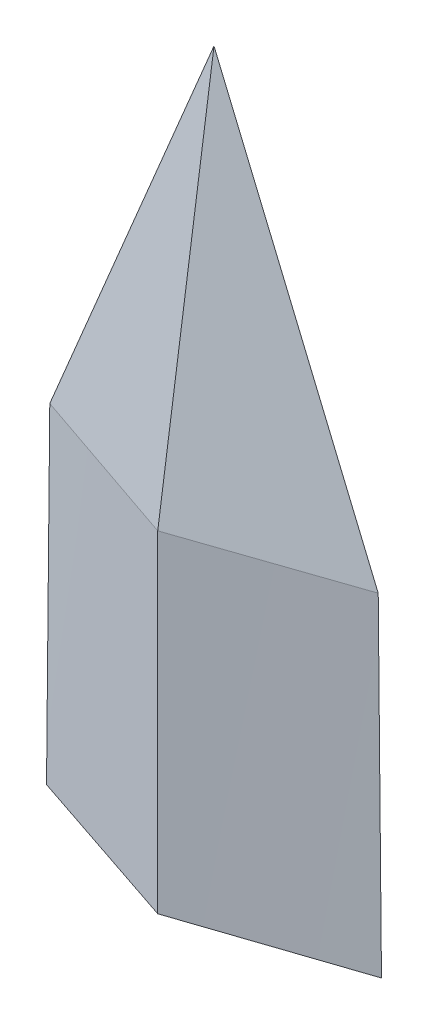
ISO-10303-21;
HEADER;
FILE_DESCRIPTION(('STEP AP214'),'2;1');
FILE_NAME('part.step','',(''),(''),'','','');
FILE_SCHEMA(('AUTOMOTIVE_DESIGN { 1 0 10303 214 1 1 1 1 }'));
ENDSEC;
DATA;
#1=APPLICATION_CONTEXT('core data for automotive mechanical design processes');
#2=APPLICATION_PROTOCOL_DEFINITION('international standard','automotive_design',2000,#1);
#3=PRODUCT_CONTEXT('',#1,'mechanical');
#4=PRODUCT('Part','Part','',(#3));
#5=PRODUCT_RELATED_PRODUCT_CATEGORY('part','',(#4));
#6=PRODUCT_DEFINITION_FORMATION('','',#4);
#7=PRODUCT_DEFINITION_CONTEXT('part definition',#1,'design');
#8=PRODUCT_DEFINITION('design','',#6,#7);
#9=PRODUCT_DEFINITION_SHAPE('','',#8);
#10=(LENGTH_UNIT() NAMED_UNIT(*) SI_UNIT(.MILLI.,.METRE.));
#11=(NAMED_UNIT(*) PLANE_ANGLE_UNIT() SI_UNIT($,.RADIAN.));
#12=(NAMED_UNIT(*) SI_UNIT($,.STERADIAN.) SOLID_ANGLE_UNIT());
#13=UNCERTAINTY_MEASURE_WITH_UNIT(LENGTH_MEASURE(1.E-05),#10,'distance_accuracy_value','');
#14=(GEOMETRIC_REPRESENTATION_CONTEXT(3) GLOBAL_UNCERTAINTY_ASSIGNED_CONTEXT((#13)) GLOBAL_UNIT_ASSIGNED_CONTEXT((#10,
#11,#12)) REPRESENTATION_CONTEXT('',''));
#15=CARTESIAN_POINT('',(0.,0.,0.));
#16=DIRECTION('',(0.,0.,1.));
#17=DIRECTION('',(1.,0.,0.));
#18=AXIS2_PLACEMENT_3D('',#15,#16,#17);
#19=CARTESIAN_POINT('',(-32.1030984066137,13.457832355646,-93.6987043311591));
#20=DIRECTION('',(-0.321172823266874,0.13463778349272,-0.937401026696127));
#21=DIRECTION('',(0.946014601230734,0.,-0.3241240106167));
#22=AXIS2_PLACEMENT_3D('',#19,#20,#21);
#23=PLANE('',#22);
#24=DIRECTION('',(0.386610447032503,0.922243114501447,0.));
#25=VECTOR('',#24,1.);
#26=CARTESIAN_POINT('',(181.068628680817,1174.33721565241,0.));
#27=LINE('',#26,#25);
#28=CARTESIAN_POINT('',(148.634785732328,1096.96763455169,0.));
#29=VERTEX_POINT('',#28);
#30=CARTESIAN_POINT('',(181.068628680818,1174.33721565241,0.));
#31=VERTEX_POINT('',#30);
#32=EDGE_CURVE('E257',#29,#31,#27,.T.);
#33=ORIENTED_EDGE('',*,*,#32,.T.);
#34=DIRECTION('',(0.,-0.989842276180155,-0.14216985716561));
#35=VECTOR('',#34,1.);
#36=CARTESIAN_POINT('',(181.068628680818,23.7360188615762,-165.259467835217));
#37=LINE('',#36,#35);
#38=CARTESIAN_POINT('',(181.068628680817,1096.96763455169,-11.1125));
#39=VERTEX_POINT('',#38);
#40=EDGE_CURVE('E12',#31,#39,#37,.T.);
#41=ORIENTED_EDGE('',*,*,#40,.T.);
#42=DIRECTION('',(-0.946014601230734,0.,0.3241240106167));
#43=VECTOR('',#42,1.);
#44=CARTESIAN_POINT('',(181.068628680817,1096.96763455169,-11.1125));
#45=LINE('',#44,#43);
#46=EDGE_CURVE('E125',#39,#29,#45,.T.);
#47=ORIENTED_EDGE('',*,*,#46,.T.);
#48=EDGE_LOOP('',(#33,#41,#47));
#49=FACE_BOUND('',#48,.T.);
#50=ADVANCED_FACE('F61',(#49),#23,.T.);
#51=CARTESIAN_POINT('',(-32.1030984066137,13.457832355646,93.6987043311591));
#52=DIRECTION('',(-0.321172823266874,0.13463778349272,0.937401026696127));
#53=DIRECTION('',(0.946014601230734,0.,0.3241240106167));
#54=AXIS2_PLACEMENT_3D('',#51,#52,#53);
#55=PLANE('',#54);
#56=DIRECTION('',(-0.946014601230734,0.,-0.3241240106167));
#57=VECTOR('',#56,1.);
#58=CARTESIAN_POINT('',(181.068628680817,1096.96763455169,11.1125));
#59=LINE('',#58,#57);
#60=CARTESIAN_POINT('',(181.068628680818,1096.96763455169,11.1125));
#61=VERTEX_POINT('',#60);
#62=EDGE_CURVE('E130',#61,#29,#59,.T.);
#63=ORIENTED_EDGE('',*,*,#62,.F.);
#64=DIRECTION('',(0.,0.989842276180155,-0.14216985716561));
#65=VECTOR('',#64,1.);
#66=CARTESIAN_POINT('',(181.068628680818,23.7360188615762,165.259467835217));
#67=LINE('',#66,#65);
#68=EDGE_CURVE('E74',#61,#31,#67,.T.);
#69=ORIENTED_EDGE('',*,*,#68,.T.);
#70=ORIENTED_EDGE('',*,*,#32,.F.);
#71=EDGE_LOOP('',(#63,#69,#70));
#72=FACE_BOUND('',#71,.T.);
#73=ADVANCED_FACE('F232',(#72),#55,.T.);
#74=CARTESIAN_POINT('',(219.716026671538,465.168027231046,0.));
#75=CARTESIAN_POINT('',(213.502471629307,1096.96763455169,0.));
#76=CARTESIAN_POINT('',(213.274793673085,465.168027231046,1.85208333333331));
#77=CARTESIAN_POINT('',(208.096831137892,1096.96763455169,1.85208333333331));
#78=CARTESIAN_POINT('',(206.833560674631,465.168027231046,3.70416666666664));
#79=CARTESIAN_POINT('',(202.691190646477,1096.96763455169,3.70416666666663));
#80=CARTESIAN_POINT('',(193.951094677724,465.168027231046,7.4083333333333));
#81=CARTESIAN_POINT('',(191.879909663647,1096.96763455169,7.4083333333333));
#82=CARTESIAN_POINT('',(187.509861679271,465.168027231046,9.26041666666665));
#83=CARTESIAN_POINT('',(186.474269172232,1096.96763455169,9.26041666666665));
#84=CARTESIAN_POINT('',(181.068628680817,465.168027231046,11.1125));
#85=CARTESIAN_POINT('',(181.068628680817,1096.96763455169,11.1125));
#86=B_SPLINE_SURFACE_WITH_KNOTS('',3,1,((#74,#75),(#76,#77),(#78,#79),(#80,#81),(#82,#83),(#84,
#85)),.UNSPECIFIED.,.F.,.F.,.F.,(4,2,4),(2,2),(0.,0.5,1.),(0.,1.),.UNSPECIFIED.);
#87=DIRECTION('',(0.,1.,0.));
#88=VECTOR('',#87,1.);
#89=CARTESIAN_POINT('',(181.068628680817,781.067830891368,11.1125));
#90=LINE('',#89,#88);
#91=CARTESIAN_POINT('',(181.068628680817,1031.46221565241,11.1125));
#92=VERTEX_POINT('',#91);
#93=EDGE_CURVE('E68',#92,#61,#90,.T.);
#94=CARTESIAN_POINT('',(181.068628680817,1031.46221565241,11.1125));
#95=CARTESIAN_POINT('',(184.245268499691,1031.46221565241,10.0453152621779));
#96=CARTESIAN_POINT('',(187.421908318565,1031.46221565241,8.97813052435588));
#97=CARTESIAN_POINT('',(193.775187956312,1031.46221565241,6.84376104871176));
#98=CARTESIAN_POINT('',(196.951827775186,1031.46221565241,5.7765763108897));
#99=CARTESIAN_POINT('',(204.801210829439,1031.46221565241,3.13959438204509));
#100=CARTESIAN_POINT('',(209.473954064819,1031.46221565241,1.56979719102255));
#101=CARTESIAN_POINT('',(214.146697300198,1031.46221565241,0.));
#102=B_SPLINE_CURVE_WITH_KNOTS('',3,(#94,#95,#96,#97,#98,#99,#100,#101),.UNSPECIFIED.,.F.,.F.,
(4,2,2,4),(0.,10.0533235415682,20.1066470831363,34.8947887203586),.UNSPECIFIED.);
#103=CARTESIAN_POINT('',(214.146697300198,1031.46221565241,0.));
#104=VERTEX_POINT('',#103);
#105=EDGE_CURVE('E203',#92,#104,#102,.T.);
#106=DIRECTION('',(-0.00983421721197636,0.99995164291671,0.));
#107=VECTOR('',#106,1.);
#108=CARTESIAN_POINT('',(219.716026671538,465.168027231046,0.));
#109=LINE('',#108,#107);
#110=CARTESIAN_POINT('',(213.502471629307,1096.96763455169,0.));
#111=VERTEX_POINT('',#110);
#112=EDGE_CURVE('E120',#104,#111,#109,.T.);
#113=DIRECTION('',(-0.946014601230734,0.,0.3241240106167));
#114=VECTOR('',#113,1.);
#115=CARTESIAN_POINT('',(213.502471629307,1096.96763455169,0.));
#116=LINE('',#115,#114);
#117=EDGE_CURVE('E127',#111,#61,#116,.T.);
#118=ORIENTED_EDGE('',*,*,#93,.F.);
#119=ORIENTED_EDGE('',*,*,#105,.T.);
#120=ORIENTED_EDGE('',*,*,#112,.T.);
#121=ORIENTED_EDGE('',*,*,#117,.T.);
#122=EDGE_LOOP('',(#118,#119,#120,#121));
#123=FACE_BOUND('',#122,.T.);
#124=ADVANCED_FACE('F165',(#123),#86,.F.);
#125=CARTESIAN_POINT('',(181.068628680817,465.168027231046,11.1125));
#126=CARTESIAN_POINT('',(181.068628680817,1096.96763455169,11.1125));
#127=CARTESIAN_POINT('',(174.627395682364,465.168027231046,9.26041666666668));
#128=CARTESIAN_POINT('',(175.662988189402,1096.96763455169,9.26041666666663));
#129=CARTESIAN_POINT('',(168.186162683911,465.168027231046,7.40833333333335));
#130=CARTESIAN_POINT('',(170.257347697988,1096.96763455169,7.40833333333328));
#131=CARTESIAN_POINT('',(155.303696687004,465.168027231046,3.70416666666668));
#132=CARTESIAN_POINT('',(159.446066715158,1096.96763455169,3.70416666666661));
#133=CARTESIAN_POINT('',(148.86246368855,465.168027231046,1.85208333333334));
#134=CARTESIAN_POINT('',(154.040426223743,1096.96763455169,1.8520833333333));
#135=CARTESIAN_POINT('',(142.421230690097,465.168027231046,0.));
#136=CARTESIAN_POINT('',(148.634785732328,1096.96763455169,0.));
#137=B_SPLINE_SURFACE_WITH_KNOTS('',3,1,((#125,#126),(#127,#128),(#129,#130),(#131,#132),(#133,
#134),(#135,#136)),.UNSPECIFIED.,.F.,.F.,.F.,(4,2,4),(2,2),(0.,0.5,1.),(0.,1.),.UNSPECIFIED.);
#138=DIRECTION('',(0.00983421721197636,0.99995164291671,0.));
#139=VECTOR('',#138,1.);
#140=CARTESIAN_POINT('',(145.528008211213,781.067830891368,0.));
#141=LINE('',#140,#139);
#142=CARTESIAN_POINT('',(147.990560061437,1031.46221565241,0.));
#143=VERTEX_POINT('',#142);
#144=EDGE_CURVE('E136',#143,#29,#141,.T.);
#145=CARTESIAN_POINT('',(147.990560061437,1031.46221565241,0.));
#146=CARTESIAN_POINT('',(151.16719988031,1031.46221565241,1.06718473782206));
#147=CARTESIAN_POINT('',(154.343839699184,1031.46221565241,2.13436947564412));
#148=CARTESIAN_POINT('',(160.697119336932,1031.46221565241,4.26873895128824));
#149=CARTESIAN_POINT('',(163.873759155805,1031.46221565241,5.3359236891103));
#150=CARTESIAN_POINT('',(171.723142210058,1031.46221565241,7.9729056179549));
#151=CARTESIAN_POINT('',(176.395885445438,1031.46221565241,9.54270280897745));
#152=CARTESIAN_POINT('',(181.068628680817,1031.46221565241,11.1125));
#153=B_SPLINE_CURVE_WITH_KNOTS('',3,(#145,#146,#147,#148,#149,#150,#151,#152),.UNSPECIFIED.,.F.,
.F.,(4,2,2,4),(0.,10.0533235415682,20.1066470831363,34.8947887203586),.UNSPECIFIED.);
#154=EDGE_CURVE('E82',#143,#92,#153,.T.);
#155=ORIENTED_EDGE('',*,*,#144,.F.);
#156=ORIENTED_EDGE('',*,*,#154,.T.);
#157=ORIENTED_EDGE('',*,*,#93,.T.);
#158=ORIENTED_EDGE('',*,*,#62,.T.);
#159=EDGE_LOOP('',(#155,#156,#157,#158));
#160=FACE_BOUND('',#159,.T.);
#161=ADVANCED_FACE('F63',(#160),#137,.F.);
#162=CARTESIAN_POINT('',(219.716026671538,465.168027231046,0.));
#163=CARTESIAN_POINT('',(213.502471629307,1096.96763455169,0.));
#164=CARTESIAN_POINT('',(213.274793673085,465.168027231046,-1.85208333333331));
#165=CARTESIAN_POINT('',(208.096831137892,1096.96763455169,-1.85208333333331));
#166=CARTESIAN_POINT('',(206.833560674631,465.168027231046,-3.70416666666664));
#167=CARTESIAN_POINT('',(202.691190646477,1096.96763455169,-3.70416666666663));
#168=CARTESIAN_POINT('',(193.951094677724,465.168027231046,-7.4083333333333));
#169=CARTESIAN_POINT('',(191.879909663647,1096.96763455169,-7.4083333333333));
#170=CARTESIAN_POINT('',(187.509861679271,465.168027231046,-9.26041666666665));
#171=CARTESIAN_POINT('',(186.474269172232,1096.96763455169,-9.26041666666665));
#172=CARTESIAN_POINT('',(181.068628680817,465.168027231046,-11.1125));
#173=CARTESIAN_POINT('',(181.068628680817,1096.96763455169,-11.1125));
#174=B_SPLINE_SURFACE_WITH_KNOTS('',3,1,((#162,#163),(#164,#165),(#166,#167),(#168,#169),(#170,
#171),(#172,#173)),.UNSPECIFIED.,.F.,.F.,.F.,(4,2,4),(2,2),(0.,0.5,1.),(0.,1.),.UNSPECIFIED.);
#175=CARTESIAN_POINT('',(214.146697300198,1031.46221565241,0.));
#176=CARTESIAN_POINT('',(210.970057481325,1031.46221565241,-1.06718473782206));
#177=CARTESIAN_POINT('',(207.793417662451,1031.46221565241,-2.13436947564412));
#178=CARTESIAN_POINT('',(201.440138024703,1031.46221565241,-4.26873895128824));
#179=CARTESIAN_POINT('',(198.26349820583,1031.46221565241,-5.3359236891103));
#180=CARTESIAN_POINT('',(190.414115151577,1031.46221565241,-7.9729056179549));
#181=CARTESIAN_POINT('',(185.741371916197,1031.46221565241,-9.54270280897745));
#182=CARTESIAN_POINT('',(181.068628680817,1031.46221565241,-11.1125));
#183=B_SPLINE_CURVE_WITH_KNOTS('',3,(#175,#176,#177,#178,#179,#180,#181,#182),.UNSPECIFIED.,.F.,
.F.,(4,2,2,4),(0.,10.0533235415682,20.1066470831363,34.8947887203586),.UNSPECIFIED.);
#184=CARTESIAN_POINT('',(181.068628680817,1031.46221565241,-11.1125));
#185=VERTEX_POINT('',#184);
#186=EDGE_CURVE('E112',#104,#185,#183,.T.);
#187=DIRECTION('',(0.,1.,0.));
#188=VECTOR('',#187,1.);
#189=CARTESIAN_POINT('',(181.068628680817,781.067830891368,-11.1125));
#190=LINE('',#189,#188);
#191=EDGE_CURVE('E90',#185,#39,#190,.T.);
#192=DIRECTION('',(-0.946014601230734,0.,-0.3241240106167));
#193=VECTOR('',#192,1.);
#194=CARTESIAN_POINT('',(213.502471629307,1096.96763455169,0.));
#195=LINE('',#194,#193);
#196=EDGE_CURVE('E132',#111,#39,#195,.T.);
#197=ORIENTED_EDGE('',*,*,#112,.F.);
#198=ORIENTED_EDGE('',*,*,#186,.T.);
#199=ORIENTED_EDGE('',*,*,#191,.T.);
#200=ORIENTED_EDGE('',*,*,#196,.F.);
#201=EDGE_LOOP('',(#197,#198,#199,#200));
#202=FACE_BOUND('',#201,.T.);
#203=ADVANCED_FACE('F119',(#202),#174,.T.);
#204=CARTESIAN_POINT('',(181.068628680817,465.168027231046,-11.1125));
#205=CARTESIAN_POINT('',(181.068628680817,1096.96763455169,-11.1125));
#206=CARTESIAN_POINT('',(174.627395682364,465.168027231046,-9.26041666666668));
#207=CARTESIAN_POINT('',(175.662988189402,1096.96763455169,-9.26041666666663));
#208=CARTESIAN_POINT('',(168.186162683911,465.168027231046,-7.40833333333335));
#209=CARTESIAN_POINT('',(170.257347697988,1096.96763455169,-7.40833333333328));
#210=CARTESIAN_POINT('',(155.303696687004,465.168027231046,-3.70416666666668));
#211=CARTESIAN_POINT('',(159.446066715158,1096.96763455169,-3.70416666666661));
#212=CARTESIAN_POINT('',(148.86246368855,465.168027231046,-1.85208333333334));
#213=CARTESIAN_POINT('',(154.040426223743,1096.96763455169,-1.8520833333333));
#214=CARTESIAN_POINT('',(142.421230690097,465.168027231046,0.));
#215=CARTESIAN_POINT('',(148.634785732328,1096.96763455169,0.));
#216=B_SPLINE_SURFACE_WITH_KNOTS('',3,1,((#204,#205),(#206,#207),(#208,#209),(#210,#211),(#212,
#213),(#214,#215)),.UNSPECIFIED.,.F.,.F.,.F.,(4,2,4),(2,2),(0.,0.5,1.),(0.,1.),.UNSPECIFIED.);
#217=CARTESIAN_POINT('',(181.068628680817,1031.46221565241,-11.1125));
#218=CARTESIAN_POINT('',(177.891988861944,1031.46221565241,-10.0453152621779));
#219=CARTESIAN_POINT('',(174.71534904307,1031.46221565241,-8.97813052435588));
#220=CARTESIAN_POINT('',(168.362069405323,1031.46221565241,-6.84376104871176));
#221=CARTESIAN_POINT('',(165.185429586449,1031.46221565241,-5.7765763108897));
#222=CARTESIAN_POINT('',(157.336046532196,1031.46221565241,-3.13959438204508));
#223=CARTESIAN_POINT('',(152.663303296816,1031.46221565241,-1.56979719102253));
#224=CARTESIAN_POINT('',(147.990560061437,1031.46221565241,0.));
#225=B_SPLINE_CURVE_WITH_KNOTS('',3,(#217,#218,#219,#220,#221,#222,#223,#224),.UNSPECIFIED.,.F.,
.F.,(4,2,2,4),(0.,10.0533235415682,20.1066470831363,34.8947887203586),.UNSPECIFIED.);
#226=EDGE_CURVE('E110',#185,#143,#225,.T.);
#227=ORIENTED_EDGE('',*,*,#191,.F.);
#228=ORIENTED_EDGE('',*,*,#226,.T.);
#229=ORIENTED_EDGE('',*,*,#144,.T.);
#230=ORIENTED_EDGE('',*,*,#46,.F.);
#231=EDGE_LOOP('',(#227,#228,#229,#230));
#232=FACE_BOUND('',#231,.T.);
#233=ADVANCED_FACE('F123',(#232),#216,.T.);
#234=CARTESIAN_POINT('',(69.4582744062542,29.1173705675479,202.726547902408));
#235=DIRECTION('',(0.321172823266876,0.13463778349272,0.937401026696127));
#236=DIRECTION('',(0.946014601230734,0.,-0.324124010616702));
#237=AXIS2_PLACEMENT_3D('',#234,#235,#236);
#238=PLANE('',#237);
#239=ORIENTED_EDGE('',*,*,#68,.F.);
#240=ORIENTED_EDGE('',*,*,#117,.F.);
#241=DIRECTION('',(0.386610447032503,-0.922243114501447,0.));
#242=VECTOR('',#241,1.);
#243=CARTESIAN_POINT('',(213.502471629307,1096.96763455169,0.));
#244=LINE('',#243,#242);
#245=EDGE_CURVE('E211',#31,#111,#244,.T.);
#246=ORIENTED_EDGE('',*,*,#245,.F.);
#247=EDGE_LOOP('',(#239,#240,#246));
#248=FACE_BOUND('',#247,.T.);
#249=ADVANCED_FACE('F160',(#248),#238,.T.);
#250=CARTESIAN_POINT('',(69.4582744062542,29.1173705675479,-202.726547902408));
#251=DIRECTION('',(0.321172823266876,0.13463778349272,-0.937401026696127));
#252=DIRECTION('',(0.946014601230734,0.,0.324124010616702));
#253=AXIS2_PLACEMENT_3D('',#250,#251,#252);
#254=PLANE('',#253);
#255=ORIENTED_EDGE('',*,*,#196,.T.);
#256=ORIENTED_EDGE('',*,*,#40,.F.);
#257=ORIENTED_EDGE('',*,*,#245,.T.);
#258=EDGE_LOOP('',(#255,#256,#257));
#259=FACE_BOUND('',#258,.T.);
#260=ADVANCED_FACE('F191',(#259),#254,.T.);
#261=CARTESIAN_POINT('',(0.,1031.46221565241,-11.1126));
#262=DIRECTION('',(0.,1.,0.));
#263=DIRECTION('',(0.,0.,1.));
#264=AXIS2_PLACEMENT_3D('',#261,#262,#263);
#265=PLANE('',#264);
#266=CARTESIAN_POINT('',(193.768628680817,1031.46221565241,0.));
#267=DIRECTION('',(0.,-1.,0.));
#268=DIRECTION('',(0.,0.,-1.));
#269=AXIS2_PLACEMENT_3D('',#266,#267,#268);
#270=CIRCLE('',#269,1.58749999999999);
#271=CARTESIAN_POINT('',(193.768628680817,1031.46221565241,-1.58749999999999));
#272=VERTEX_POINT('',#271);
#273=EDGE_CURVE('E338',#272,#272,#270,.T.);
#274=ORIENTED_EDGE('',*,*,#273,.F.);
#275=EDGE_LOOP('',(#274));
#276=FACE_BOUND('',#275,.T.);
#277=CARTESIAN_POINT('',(168.368628680817,1031.46221565241,0.));
#278=DIRECTION('',(0.,-1.,0.));
#279=DIRECTION('',(0.,0.,-1.));
#280=AXIS2_PLACEMENT_3D('',#277,#278,#279);
#281=CIRCLE('',#280,1.58749999999999);
#282=CARTESIAN_POINT('',(168.368628680817,1031.46221565241,-1.58749999999999));
#283=VERTEX_POINT('',#282);
#284=EDGE_CURVE('E180',#283,#283,#281,.T.);
#285=ORIENTED_EDGE('',*,*,#284,.F.);
#286=EDGE_LOOP('',(#285));
#287=FACE_BOUND('',#286,.T.);
#288=CARTESIAN_POINT('',(181.068628680817,1031.46221565241,0.));
#289=DIRECTION('',(0.,1.,0.));
#290=DIRECTION('',(0.,0.,1.));
#291=AXIS2_PLACEMENT_3D('',#288,#289,#290);
#292=CIRCLE('',#291,4.76250000000001);
#293=CARTESIAN_POINT('',(181.068628680817,1031.46221565241,-4.76250000000001));
#294=VERTEX_POINT('',#293);
#295=EDGE_CURVE('E116',#294,#294,#292,.F.);
#296=ORIENTED_EDGE('',*,*,#295,.F.);
#297=EDGE_LOOP('',(#296));
#298=FACE_BOUND('',#297,.T.);
#299=ORIENTED_EDGE('',*,*,#154,.F.);
#300=ORIENTED_EDGE('',*,*,#226,.F.);
#301=ORIENTED_EDGE('',*,*,#186,.F.);
#302=ORIENTED_EDGE('',*,*,#105,.F.);
#303=EDGE_LOOP('',(#299,#300,#301,#302));
#304=FACE_BOUND('',#303,.T.);
#305=ADVANCED_FACE('F111',(#276,#287,#298,#304),#265,.F.);
#306=CARTESIAN_POINT('',(181.068628680817,1100.16802723105,0.));
#307=DIRECTION('',(0.,-1.,0.));
#308=DIRECTION('',(0.,0.,-1.));
#309=AXIS2_PLACEMENT_3D('',#306,#307,#308);
#310=PLANE('',#309);
#311=CARTESIAN_POINT('',(181.068628680817,1100.16802723105,0.));
#312=DIRECTION('',(0.,-1.,0.));
#313=DIRECTION('',(0.,0.,-1.));
#314=AXIS2_PLACEMENT_3D('',#311,#312,#313);
#315=CIRCLE('',#314,4.76250000000001);
#316=CARTESIAN_POINT('',(181.068628680817,1100.16802723105,-4.76250000000001));
#317=VERTEX_POINT('',#316);
#318=EDGE_CURVE('E208',#317,#317,#315,.T.);
#319=ORIENTED_EDGE('',*,*,#318,.T.);
#320=EDGE_LOOP('',(#319));
#321=FACE_BOUND('',#320,.T.);
#322=ADVANCED_FACE('F190',(#321),#310,.T.);
#323=CARTESIAN_POINT('',(181.068628680817,1100.16802723105,0.));
#324=DIRECTION('',(0.,-1.,0.));
#325=DIRECTION('',(0.,0.,-1.));
#326=AXIS2_PLACEMENT_3D('',#323,#324,#325);
#327=CYLINDRICAL_SURFACE('',#326,4.76250000000001);
#328=CARTESIAN_POINT('',(181.068628680817,1031.46221565241,-4.76250000000001));
#329=CARTESIAN_POINT('',(181.068628680817,1032.17790118968,-4.76250000000001));
#330=CARTESIAN_POINT('',(181.068628680817,1032.89358672696,-4.76250000000001));
#331=CARTESIAN_POINT('',(181.068628680817,1034.32495780152,-4.76250000000001));
#332=CARTESIAN_POINT('',(181.068628680817,1035.04064333879,-4.76250000000001));
#333=CARTESIAN_POINT('',(181.068628680817,1036.47201441335,-4.76250000000001));
#334=CARTESIAN_POINT('',(181.068628680817,1037.18769995063,-4.76250000000001));
#335=CARTESIAN_POINT('',(181.068628680817,1038.61907102518,-4.76250000000001));
#336=CARTESIAN_POINT('',(181.068628680817,1039.33475656246,-4.76250000000001));
#337=CARTESIAN_POINT('',(181.068628680817,1040.76612763701,-4.76250000000001));
#338=CARTESIAN_POINT('',(181.068628680817,1041.48181317429,-4.76250000000001));
#339=CARTESIAN_POINT('',(181.068628680817,1042.91318424885,-4.76250000000001));
#340=CARTESIAN_POINT('',(181.068628680817,1043.62886978612,-4.76250000000001));
#341=CARTESIAN_POINT('',(181.068628680817,1045.06024086068,-4.76250000000001));
#342=CARTESIAN_POINT('',(181.068628680817,1045.77592639796,-4.76250000000001));
#343=CARTESIAN_POINT('',(181.068628680817,1047.20729747251,-4.76250000000001));
#344=CARTESIAN_POINT('',(181.068628680817,1047.92298300979,-4.76250000000001));
#345=CARTESIAN_POINT('',(181.068628680817,1049.35435408434,-4.76250000000001));
#346=CARTESIAN_POINT('',(181.068628680817,1050.07003962162,-4.76250000000001));
#347=CARTESIAN_POINT('',(181.068628680817,1051.50141069618,-4.76250000000001));
#348=CARTESIAN_POINT('',(181.068628680817,1052.21709623345,-4.76250000000001));
#349=CARTESIAN_POINT('',(181.068628680817,1053.64846730801,-4.76250000000001));
#350=CARTESIAN_POINT('',(181.068628680817,1054.36415284529,-4.76250000000001));
#351=CARTESIAN_POINT('',(181.068628680817,1055.79552391984,-4.76250000000001));
#352=CARTESIAN_POINT('',(181.068628680817,1056.51120945712,-4.76250000000001));
#353=CARTESIAN_POINT('',(181.068628680817,1057.94258053167,-4.76250000000001));
#354=CARTESIAN_POINT('',(181.068628680817,1058.65826606895,-4.76250000000001));
#355=CARTESIAN_POINT('',(181.068628680817,1060.08963714351,-4.76250000000001));
#356=CARTESIAN_POINT('',(181.068628680817,1060.80532268078,-4.76250000000001));
#357=CARTESIAN_POINT('',(181.068628680817,1062.23669375534,-4.76250000000001));
#358=CARTESIAN_POINT('',(181.068628680817,1062.95237929262,-4.76250000000001));
#359=CARTESIAN_POINT('',(181.068628680817,1064.38375036717,-4.76250000000001));
#360=CARTESIAN_POINT('',(181.068628680817,1065.09943590445,-4.76250000000001));
#361=CARTESIAN_POINT('',(181.068628680817,1066.530806979,-4.76250000000001));
#362=CARTESIAN_POINT('',(181.068628680817,1067.24649251628,-4.76250000000001));
#363=CARTESIAN_POINT('',(181.068628680817,1068.67786359084,-4.76250000000001));
#364=CARTESIAN_POINT('',(181.068628680817,1069.39354912811,-4.76250000000001));
#365=CARTESIAN_POINT('',(181.068628680817,1070.82492020267,-4.76250000000001));
#366=CARTESIAN_POINT('',(181.068628680817,1071.54060573995,-4.76250000000001));
#367=CARTESIAN_POINT('',(181.068628680817,1072.9719768145,-4.76250000000001));
#368=CARTESIAN_POINT('',(181.068628680817,1073.68766235178,-4.76250000000001));
#369=CARTESIAN_POINT('',(181.068628680817,1075.11903342633,-4.76250000000001));
#370=CARTESIAN_POINT('',(181.068628680817,1075.83471896361,-4.76250000000001));
#371=CARTESIAN_POINT('',(181.068628680817,1077.26609003817,-4.76250000000001));
#372=CARTESIAN_POINT('',(181.068628680817,1077.98177557544,-4.76250000000001));
#373=CARTESIAN_POINT('',(181.068628680817,1079.41314665,-4.76250000000001));
#374=CARTESIAN_POINT('',(181.068628680817,1080.12883218728,-4.76250000000001));
#375=CARTESIAN_POINT('',(181.068628680817,1081.56020326183,-4.76250000000001));
#376=CARTESIAN_POINT('',(181.068628680817,1082.27588879911,-4.76250000000001));
#377=CARTESIAN_POINT('',(181.068628680817,1083.70725987366,-4.76250000000001));
#378=CARTESIAN_POINT('',(181.068628680817,1084.42294541094,-4.76250000000001));
#379=CARTESIAN_POINT('',(181.068628680817,1085.8543164855,-4.76250000000001));
#380=CARTESIAN_POINT('',(181.068628680817,1086.57000202277,-4.76250000000001));
#381=CARTESIAN_POINT('',(181.068628680817,1088.00137309733,-4.76250000000001));
#382=CARTESIAN_POINT('',(181.068628680817,1088.71705863461,-4.76250000000001));
#383=CARTESIAN_POINT('',(181.068628680817,1090.14842970916,-4.76250000000001));
#384=CARTESIAN_POINT('',(181.068628680817,1090.86411524644,-4.76250000000001));
#385=CARTESIAN_POINT('',(181.068628680817,1092.29548632099,-4.76250000000001));
#386=CARTESIAN_POINT('',(181.068628680817,1093.01117185827,-4.76250000000001));
#387=CARTESIAN_POINT('',(181.068628680817,1094.44254293283,-4.76250000000001));
#388=CARTESIAN_POINT('',(181.068628680817,1095.1582284701,-4.76250000000001));
#389=CARTESIAN_POINT('',(181.068628680817,1096.58959954466,-4.76250000000001));
#390=CARTESIAN_POINT('',(181.068628680817,1097.30528508194,-4.76250000000001));
#391=CARTESIAN_POINT('',(181.068628680817,1098.73665615649,-4.76250000000001));
#392=CARTESIAN_POINT('',(181.068628680817,1099.45234169377,-4.76250000000001));
#393=CARTESIAN_POINT('',(181.068628680817,1100.16802723105,-4.76250000000001));
#394=B_SPLINE_CURVE_WITH_KNOTS('',3,(#328,#329,#330,#331,#332,#333,#334,#335,#336,#337,#338,
#339,#340,#341,#342,#343,#344,#345,#346,#347,#348,#349,#350,#351,#352,#353,#354,#355,#356,#357,
#358,#359,#360,#361,#362,#363,#364,#365,#366,#367,#368,#369,#370,#371,#372,#373,#374,#375,#376,
#377,#378,#379,#380,#381,#382,#383,#384,#385,#386,#387,#388,#389,#390,#391,#392,#393),
.UNSPECIFIED.,.F.,.F.,(4,2,2,2,2,2,2,2,2,2,2,2,2,2,2,2,2,2,2,2,2,2,2,2,2,2,2,2,2,2,2,2,4),(0.,
2.14705661183268,4.29411322366513,6.44116983549758,8.58822644733004,10.7352830591627,
12.8823396709952,15.0293962828276,17.1764528946601,19.3235095064925,21.4705661183252,
23.6176227301577,25.7646793419901,27.9117359538226,30.0587925656552,32.2058491774877,
34.3529057893202,36.4999624011526,38.6470190129851,40.7940756248177,42.9411322366502,
45.0881888484826,47.2352454603151,49.3823020721478,51.5293586839802,53.6764152958127,
55.8234719076451,57.9705285194776,60.1175851313103,62.2646417431427,64.4116983549752,
66.5587549668076,68.7058115786401),.UNSPECIFIED.);
#395=EDGE_CURVE('BSEAM228',#294,#317,#394,.T.);
#396=ORIENTED_EDGE('',*,*,#295,.T.);
#397=ORIENTED_EDGE('',*,*,#318,.F.);
#398=ORIENTED_EDGE('',*,*,#395,.T.);
#399=ORIENTED_EDGE('',*,*,#395,.F.);
#400=EDGE_LOOP('',(#396,#398,#397,#399));
#401=FACE_BOUND('',#400,.T.);
#402=ADVANCED_FACE('F228',(#401),#327,.F.);
#403=CARTESIAN_POINT('',(168.368628680817,1044.16221565241,0.));
#404=DIRECTION('',(0.,-1.,0.));
#405=DIRECTION('',(0.,0.,-1.));
#406=AXIS2_PLACEMENT_3D('',#403,#404,#405);
#407=CYLINDRICAL_SURFACE('',#406,1.58749999999999);
#408=CARTESIAN_POINT('',(168.368628680817,1044.16221565241,0.));
#409=DIRECTION('',(0.,-1.,0.));
#410=DIRECTION('',(0.,0.,-1.));
#411=AXIS2_PLACEMENT_3D('',#408,#409,#410);
#412=CIRCLE('',#411,1.58749999999999);
#413=CARTESIAN_POINT('',(168.368628680817,1044.16221565241,-1.58749999999999));
#414=VERTEX_POINT('',#413);
#415=EDGE_CURVE('E329',#414,#414,#412,.T.);
#416=ORIENTED_EDGE('',*,*,#415,.F.);
#417=EDGE_LOOP('',(#416));
#418=FACE_BOUND('',#417,.T.);
#419=ORIENTED_EDGE('',*,*,#284,.T.);
#420=EDGE_LOOP('',(#419));
#421=FACE_BOUND('',#420,.T.);
#422=ADVANCED_FACE('F193',(#418,#421),#407,.F.);
#423=CARTESIAN_POINT('',(168.368628680817,1044.16221565241,0.));
#424=DIRECTION('',(0.,-1.,0.));
#425=DIRECTION('',(0.,0.,-1.));
#426=AXIS2_PLACEMENT_3D('',#423,#424,#425);
#427=PLANE('',#426);
#428=ORIENTED_EDGE('',*,*,#415,.T.);
#429=EDGE_LOOP('',(#428));
#430=FACE_BOUND('',#429,.T.);
#431=ADVANCED_FACE('F349',(#430),#427,.T.);
#432=CARTESIAN_POINT('',(193.768628680817,1044.16221565241,0.));
#433=DIRECTION('',(0.,-1.,0.));
#434=DIRECTION('',(0.,0.,-1.));
#435=AXIS2_PLACEMENT_3D('',#432,#433,#434);
#436=CYLINDRICAL_SURFACE('',#435,1.58749999999999);
#437=CARTESIAN_POINT('',(193.768628680817,1044.16221565241,0.));
#438=DIRECTION('',(0.,-1.,0.));
#439=DIRECTION('',(0.,0.,-1.));
#440=AXIS2_PLACEMENT_3D('',#437,#438,#439);
#441=CIRCLE('',#440,1.58749999999999);
#442=CARTESIAN_POINT('',(193.768628680817,1044.16221565241,-1.58749999999999));
#443=VERTEX_POINT('',#442);
#444=EDGE_CURVE('E336',#443,#443,#441,.T.);
#445=ORIENTED_EDGE('',*,*,#444,.F.);
#446=EDGE_LOOP('',(#445));
#447=FACE_BOUND('',#446,.T.);
#448=ORIENTED_EDGE('',*,*,#273,.T.);
#449=EDGE_LOOP('',(#448));
#450=FACE_BOUND('',#449,.T.);
#451=ADVANCED_FACE('F346',(#447,#450),#436,.F.);
#452=CARTESIAN_POINT('',(193.768628680817,1044.16221565241,0.));
#453=DIRECTION('',(0.,-1.,0.));
#454=DIRECTION('',(0.,0.,-1.));
#455=AXIS2_PLACEMENT_3D('',#452,#453,#454);
#456=PLANE('',#455);
#457=ORIENTED_EDGE('',*,*,#444,.T.);
#458=EDGE_LOOP('',(#457));
#459=FACE_BOUND('',#458,.T.);
#460=ADVANCED_FACE('F344',(#459),#456,.T.);
#461=CLOSED_SHELL('',(#50,#73,#124,#161,#203,#233,#249,#260,#305,#322,#402,#422,#431,#451,#460));
#462=MANIFOLD_SOLID_BREP('B2',#461);
#463=ADVANCED_BREP_SHAPE_REPRESENTATION('',(#18,#462),#14);
#464=SHAPE_DEFINITION_REPRESENTATION(#9,#463);
ENDSEC;
END-ISO-10303-21;
